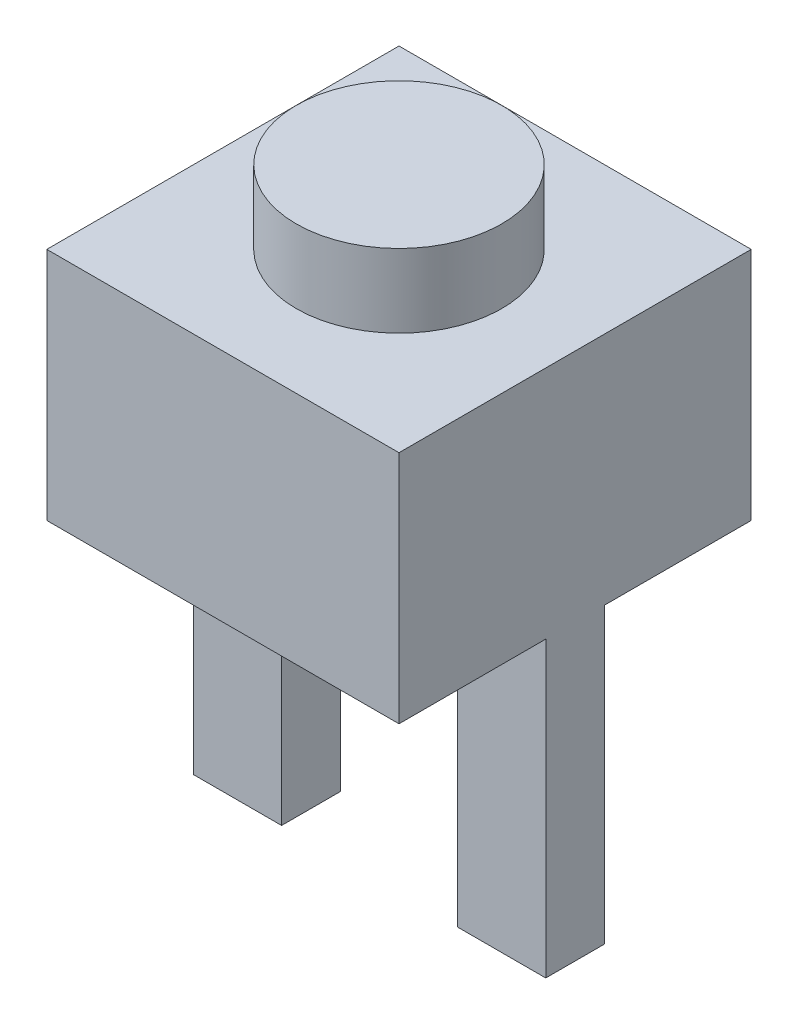
ISO-10303-21;
HEADER;
FILE_DESCRIPTION(('STEP AP214'),'2;1');
FILE_NAME('part.step','',(''),(''),'','','');
FILE_SCHEMA(('AUTOMOTIVE_DESIGN { 1 0 10303 214 1 1 1 1 }'));
ENDSEC;
DATA;
#1=APPLICATION_CONTEXT('core data for automotive mechanical design processes');
#2=APPLICATION_PROTOCOL_DEFINITION('international standard','automotive_design',2000,#1);
#3=PRODUCT_CONTEXT('',#1,'mechanical');
#4=PRODUCT('Part','Part','',(#3));
#5=PRODUCT_RELATED_PRODUCT_CATEGORY('part','',(#4));
#6=PRODUCT_DEFINITION_FORMATION('','',#4);
#7=PRODUCT_DEFINITION_CONTEXT('part definition',#1,'design');
#8=PRODUCT_DEFINITION('design','',#6,#7);
#9=PRODUCT_DEFINITION_SHAPE('','',#8);
#10=(LENGTH_UNIT() NAMED_UNIT(*) SI_UNIT(.MILLI.,.METRE.));
#11=(NAMED_UNIT(*) PLANE_ANGLE_UNIT() SI_UNIT($,.RADIAN.));
#12=(NAMED_UNIT(*) SI_UNIT($,.STERADIAN.) SOLID_ANGLE_UNIT());
#13=UNCERTAINTY_MEASURE_WITH_UNIT(LENGTH_MEASURE(1.E-05),#10,'distance_accuracy_value','');
#14=(GEOMETRIC_REPRESENTATION_CONTEXT(3) GLOBAL_UNCERTAINTY_ASSIGNED_CONTEXT((#13)) GLOBAL_UNIT_ASSIGNED_CONTEXT((#10,
#11,#12)) REPRESENTATION_CONTEXT('',''));
#15=CARTESIAN_POINT('',(0.,0.,0.));
#16=DIRECTION('',(0.,0.,1.));
#17=DIRECTION('',(1.,0.,0.));
#18=AXIS2_PLACEMENT_3D('',#15,#16,#17);
#19=CARTESIAN_POINT('',(0.,0.,0.));
#20=DIRECTION('',(0.,-1.,0.));
#21=DIRECTION('',(0.,0.,-1.));
#22=AXIS2_PLACEMENT_3D('',#19,#20,#21);
#23=PLANE('',#22);
#24=DIRECTION('',(0.,0.,-1.));
#25=VECTOR('',#24,1.);
#26=CARTESIAN_POINT('',(-1.5,0.,0.5));
#27=LINE('',#26,#25);
#28=CARTESIAN_POINT('',(-1.5,0.,0.5));
#29=VERTEX_POINT('',#28);
#30=CARTESIAN_POINT('',(-1.5,0.,-0.5));
#31=VERTEX_POINT('',#30);
#32=EDGE_CURVE('E57',#29,#31,#27,.T.);
#33=ORIENTED_EDGE('',*,*,#32,.T.);
#34=DIRECTION('',(1.,0.,0.));
#35=VECTOR('',#34,1.);
#36=CARTESIAN_POINT('',(-3.,0.,-0.5));
#37=LINE('',#36,#35);
#38=CARTESIAN_POINT('',(-3.,0.,-0.5));
#39=VERTEX_POINT('',#38);
#40=EDGE_CURVE('E155',#39,#31,#37,.T.);
#41=ORIENTED_EDGE('',*,*,#40,.F.);
#42=DIRECTION('',(0.,0.,-1.));
#43=VECTOR('',#42,1.);
#44=CARTESIAN_POINT('',(-3.,0.,3.));
#45=LINE('',#44,#43);
#46=CARTESIAN_POINT('',(-3.,0.,-3.));
#47=VERTEX_POINT('',#46);
#48=EDGE_CURVE('E136',#39,#47,#45,.T.);
#49=ORIENTED_EDGE('',*,*,#48,.T.);
#50=DIRECTION('',(1.,0.,0.));
#51=VECTOR('',#50,1.);
#52=CARTESIAN_POINT('',(-3.,0.,-3.));
#53=LINE('',#52,#51);
#54=CARTESIAN_POINT('',(3.,0.,-3.));
#55=VERTEX_POINT('',#54);
#56=EDGE_CURVE('E135',#47,#55,#53,.T.);
#57=ORIENTED_EDGE('',*,*,#56,.T.);
#58=DIRECTION('',(0.,0.,-1.));
#59=VECTOR('',#58,1.);
#60=CARTESIAN_POINT('',(3.,0.,3.));
#61=LINE('',#60,#59);
#62=CARTESIAN_POINT('',(3.,0.,-0.5));
#63=VERTEX_POINT('',#62);
#64=EDGE_CURVE('E234',#63,#55,#61,.T.);
#65=ORIENTED_EDGE('',*,*,#64,.F.);
#66=DIRECTION('',(-1.,0.,0.));
#67=VECTOR('',#66,1.);
#68=CARTESIAN_POINT('',(0.,0.,-0.5));
#69=LINE('',#68,#67);
#70=CARTESIAN_POINT('',(1.5,0.,-0.5));
#71=VERTEX_POINT('',#70);
#72=EDGE_CURVE('E178',#63,#71,#69,.T.);
#73=ORIENTED_EDGE('',*,*,#72,.T.);
#74=DIRECTION('',(0.,0.,-1.));
#75=VECTOR('',#74,1.);
#76=CARTESIAN_POINT('',(1.5,0.,0.));
#77=LINE('',#76,#75);
#78=CARTESIAN_POINT('',(1.5,0.,0.5));
#79=VERTEX_POINT('',#78);
#80=EDGE_CURVE('E192',#79,#71,#77,.T.);
#81=ORIENTED_EDGE('',*,*,#80,.F.);
#82=DIRECTION('',(-1.,0.,0.));
#83=VECTOR('',#82,1.);
#84=CARTESIAN_POINT('',(0.,0.,0.5));
#85=LINE('',#84,#83);
#86=CARTESIAN_POINT('',(3.,0.,0.5));
#87=VERTEX_POINT('',#86);
#88=EDGE_CURVE('E164',#87,#79,#85,.T.);
#89=ORIENTED_EDGE('',*,*,#88,.F.);
#90=CARTESIAN_POINT('',(3.,0.,3.));
#91=VERTEX_POINT('',#90);
#92=EDGE_CURVE('E235',#91,#87,#61,.T.);
#93=ORIENTED_EDGE('',*,*,#92,.F.);
#94=DIRECTION('',(1.,0.,0.));
#95=VECTOR('',#94,1.);
#96=CARTESIAN_POINT('',(-3.,0.,3.));
#97=LINE('',#96,#95);
#98=CARTESIAN_POINT('',(-3.,0.,3.));
#99=VERTEX_POINT('',#98);
#100=EDGE_CURVE('E132',#99,#91,#97,.T.);
#101=ORIENTED_EDGE('',*,*,#100,.F.);
#102=CARTESIAN_POINT('',(-3.,0.,0.5));
#103=VERTEX_POINT('',#102);
#104=EDGE_CURVE('E129',#99,#103,#45,.T.);
#105=ORIENTED_EDGE('',*,*,#104,.T.);
#106=DIRECTION('',(1.,0.,0.));
#107=VECTOR('',#106,1.);
#108=CARTESIAN_POINT('',(-3.,0.,0.5));
#109=LINE('',#108,#107);
#110=EDGE_CURVE('E62',#103,#29,#109,.T.);
#111=ORIENTED_EDGE('',*,*,#110,.T.);
#112=EDGE_LOOP('',(#33,#41,#49,#57,#65,#73,#81,#89,#93,#101,#105,#111));
#113=FACE_BOUND('',#112,.T.);
#114=ADVANCED_FACE('F39',(#113),#23,.T.);
#115=CARTESIAN_POINT('',(-3.,4.,3.));
#116=DIRECTION('',(-1.,0.,0.));
#117=DIRECTION('',(0.,0.,1.));
#118=AXIS2_PLACEMENT_3D('',#115,#116,#117);
#119=PLANE('',#118);
#120=ORIENTED_EDGE('',*,*,#104,.F.);
#121=DIRECTION('',(0.,-1.,0.));
#122=VECTOR('',#121,1.);
#123=CARTESIAN_POINT('',(-3.,4.,3.));
#124=LINE('',#123,#122);
#125=CARTESIAN_POINT('',(-3.,4.,3.));
#126=VERTEX_POINT('',#125);
#127=EDGE_CURVE('E49',#126,#99,#124,.T.);
#128=ORIENTED_EDGE('',*,*,#127,.F.);
#129=DIRECTION('',(0.,0.,-1.));
#130=VECTOR('',#129,1.);
#131=CARTESIAN_POINT('',(-3.,4.,3.));
#132=LINE('',#131,#130);
#133=CARTESIAN_POINT('',(-3.,4.,-3.));
#134=VERTEX_POINT('',#133);
#135=EDGE_CURVE('E217',#126,#134,#132,.T.);
#136=ORIENTED_EDGE('',*,*,#135,.T.);
#137=DIRECTION('',(0.,-1.,0.));
#138=VECTOR('',#137,1.);
#139=CARTESIAN_POINT('',(-3.,4.,-3.));
#140=LINE('',#139,#138);
#141=EDGE_CURVE('E43',#134,#47,#140,.T.);
#142=ORIENTED_EDGE('',*,*,#141,.T.);
#143=ORIENTED_EDGE('',*,*,#48,.F.);
#144=DIRECTION('',(0.,1.,0.));
#145=VECTOR('',#144,1.);
#146=CARTESIAN_POINT('',(-3.,-5.,-0.5));
#147=LINE('',#146,#145);
#148=CARTESIAN_POINT('',(-3.,-5.,-0.5));
#149=VERTEX_POINT('',#148);
#150=EDGE_CURVE('E432',#149,#39,#147,.T.);
#151=ORIENTED_EDGE('',*,*,#150,.F.);
#152=DIRECTION('',(0.,0.,-1.));
#153=VECTOR('',#152,1.);
#154=CARTESIAN_POINT('',(-3.,-5.,0.5));
#155=LINE('',#154,#153);
#156=CARTESIAN_POINT('',(-3.,-5.,0.5));
#157=VERTEX_POINT('',#156);
#158=EDGE_CURVE('E142',#157,#149,#155,.T.);
#159=ORIENTED_EDGE('',*,*,#158,.F.);
#160=DIRECTION('',(0.,1.,0.));
#161=VECTOR('',#160,1.);
#162=CARTESIAN_POINT('',(-3.,-5.,0.5));
#163=LINE('',#162,#161);
#164=EDGE_CURVE('E139',#157,#103,#163,.T.);
#165=ORIENTED_EDGE('',*,*,#164,.T.);
#166=EDGE_LOOP('',(#120,#128,#136,#142,#143,#151,#159,#165));
#167=FACE_BOUND('',#166,.T.);
#168=ADVANCED_FACE('F41',(#167),#119,.T.);
#169=CARTESIAN_POINT('',(-3.,4.,3.));
#170=DIRECTION('',(0.,0.,-1.));
#171=DIRECTION('',(-1.,0.,0.));
#172=AXIS2_PLACEMENT_3D('',#169,#170,#171);
#173=PLANE('',#172);
#174=ORIENTED_EDGE('',*,*,#100,.T.);
#175=DIRECTION('',(0.,-1.,0.));
#176=VECTOR('',#175,1.);
#177=CARTESIAN_POINT('',(3.,4.,3.));
#178=LINE('',#177,#176);
#179=CARTESIAN_POINT('',(3.,4.,3.));
#180=VERTEX_POINT('',#179);
#181=EDGE_CURVE('E243',#180,#91,#178,.T.);
#182=ORIENTED_EDGE('',*,*,#181,.F.);
#183=DIRECTION('',(1.,0.,0.));
#184=VECTOR('',#183,1.);
#185=CARTESIAN_POINT('',(-3.,4.,3.));
#186=LINE('',#185,#184);
#187=EDGE_CURVE('E228',#126,#180,#186,.T.);
#188=ORIENTED_EDGE('',*,*,#187,.F.);
#189=ORIENTED_EDGE('',*,*,#127,.T.);
#190=EDGE_LOOP('',(#174,#182,#188,#189));
#191=FACE_BOUND('',#190,.T.);
#192=ADVANCED_FACE('F280',(#191),#173,.F.);
#193=CARTESIAN_POINT('',(3.,4.,3.));
#194=DIRECTION('',(-1.,0.,0.));
#195=DIRECTION('',(0.,0.,1.));
#196=AXIS2_PLACEMENT_3D('',#193,#194,#195);
#197=PLANE('',#196);
#198=ORIENTED_EDGE('',*,*,#92,.T.);
#199=DIRECTION('',(0.,1.,0.));
#200=VECTOR('',#199,1.);
#201=CARTESIAN_POINT('',(3.,-5.,0.5));
#202=LINE('',#201,#200);
#203=CARTESIAN_POINT('',(3.,-5.,0.5));
#204=VERTEX_POINT('',#203);
#205=EDGE_CURVE('E188',#204,#87,#202,.T.);
#206=ORIENTED_EDGE('',*,*,#205,.F.);
#207=DIRECTION('',(0.,0.,1.));
#208=VECTOR('',#207,1.);
#209=CARTESIAN_POINT('',(3.,-5.,0.));
#210=LINE('',#209,#208);
#211=CARTESIAN_POINT('',(3.,-5.,-0.5));
#212=VERTEX_POINT('',#211);
#213=EDGE_CURVE('E185',#212,#204,#210,.T.);
#214=ORIENTED_EDGE('',*,*,#213,.F.);
#215=DIRECTION('',(0.,1.,0.));
#216=VECTOR('',#215,1.);
#217=CARTESIAN_POINT('',(3.,-5.,-0.5));
#218=LINE('',#217,#216);
#219=EDGE_CURVE('E201',#212,#63,#218,.T.);
#220=ORIENTED_EDGE('',*,*,#219,.T.);
#221=ORIENTED_EDGE('',*,*,#64,.T.);
#222=DIRECTION('',(0.,-1.,0.));
#223=VECTOR('',#222,1.);
#224=CARTESIAN_POINT('',(3.,4.,-3.));
#225=LINE('',#224,#223);
#226=CARTESIAN_POINT('',(3.,4.,-3.));
#227=VERTEX_POINT('',#226);
#228=EDGE_CURVE('E246',#227,#55,#225,.T.);
#229=ORIENTED_EDGE('',*,*,#228,.F.);
#230=DIRECTION('',(0.,0.,-1.));
#231=VECTOR('',#230,1.);
#232=CARTESIAN_POINT('',(3.,4.,3.));
#233=LINE('',#232,#231);
#234=EDGE_CURVE('E225',#180,#227,#233,.T.);
#235=ORIENTED_EDGE('',*,*,#234,.F.);
#236=ORIENTED_EDGE('',*,*,#181,.T.);
#237=EDGE_LOOP('',(#198,#206,#214,#220,#221,#229,#235,#236));
#238=FACE_BOUND('',#237,.T.);
#239=ADVANCED_FACE('F262',(#238),#197,.F.);
#240=CARTESIAN_POINT('',(-3.,4.,-3.));
#241=DIRECTION('',(0.,0.,-1.));
#242=DIRECTION('',(-1.,0.,0.));
#243=AXIS2_PLACEMENT_3D('',#240,#241,#242);
#244=PLANE('',#243);
#245=ORIENTED_EDGE('',*,*,#56,.F.);
#246=ORIENTED_EDGE('',*,*,#141,.F.);
#247=DIRECTION('',(1.,0.,0.));
#248=VECTOR('',#247,1.);
#249=CARTESIAN_POINT('',(-3.,4.,-3.));
#250=LINE('',#249,#248);
#251=EDGE_CURVE('E221',#134,#227,#250,.T.);
#252=ORIENTED_EDGE('',*,*,#251,.T.);
#253=ORIENTED_EDGE('',*,*,#228,.T.);
#254=EDGE_LOOP('',(#245,#246,#252,#253));
#255=FACE_BOUND('',#254,.T.);
#256=ADVANCED_FACE('F258',(#255),#244,.T.);
#257=CARTESIAN_POINT('',(0.,4.,0.));
#258=DIRECTION('',(0.,-1.,0.));
#259=DIRECTION('',(0.,0.,-1.));
#260=AXIS2_PLACEMENT_3D('',#257,#258,#259);
#261=PLANE('',#260);
#262=CARTESIAN_POINT('',(0.,4.,0.));
#263=DIRECTION('',(0.,1.,0.));
#264=DIRECTION('',(0.,0.,1.));
#265=AXIS2_PLACEMENT_3D('',#262,#263,#264);
#266=CIRCLE('',#265,1.75);
#267=CARTESIAN_POINT('',(0.,4.,1.75));
#268=VERTEX_POINT('',#267);
#269=EDGE_CURVE('E11',#268,#268,#266,.T.);
#270=ORIENTED_EDGE('',*,*,#269,.F.);
#271=EDGE_LOOP('',(#270));
#272=FACE_BOUND('',#271,.T.);
#273=ORIENTED_EDGE('',*,*,#135,.F.);
#274=ORIENTED_EDGE('',*,*,#187,.T.);
#275=ORIENTED_EDGE('',*,*,#234,.T.);
#276=ORIENTED_EDGE('',*,*,#251,.F.);
#277=EDGE_LOOP('',(#273,#274,#275,#276));
#278=FACE_BOUND('',#277,.T.);
#279=ADVANCED_FACE('F282',(#272,#278),#261,.F.);
#280=CARTESIAN_POINT('',(0.,5.25,0.));
#281=DIRECTION('',(0.,-1.,0.));
#282=DIRECTION('',(0.,0.,-1.));
#283=AXIS2_PLACEMENT_3D('',#280,#281,#282);
#284=CYLINDRICAL_SURFACE('',#283,1.75);
#285=CARTESIAN_POINT('',(0.,5.25,0.));
#286=DIRECTION('',(0.,1.,0.));
#287=DIRECTION('',(0.,0.,1.));
#288=AXIS2_PLACEMENT_3D('',#285,#286,#287);
#289=CIRCLE('',#288,1.75);
#290=CARTESIAN_POINT('',(0.,5.25,1.75));
#291=VERTEX_POINT('',#290);
#292=EDGE_CURVE('E213',#291,#291,#289,.T.);
#293=ORIENTED_EDGE('',*,*,#292,.F.);
#294=EDGE_LOOP('',(#293));
#295=FACE_BOUND('',#294,.T.);
#296=ORIENTED_EDGE('',*,*,#269,.T.);
#297=EDGE_LOOP('',(#296));
#298=FACE_BOUND('',#297,.T.);
#299=ADVANCED_FACE('F284',(#295,#298),#284,.T.);
#300=CARTESIAN_POINT('',(0.,5.25,0.));
#301=DIRECTION('',(0.,1.,0.));
#302=DIRECTION('',(0.,0.,1.));
#303=AXIS2_PLACEMENT_3D('',#300,#301,#302);
#304=PLANE('',#303);
#305=ORIENTED_EDGE('',*,*,#292,.T.);
#306=EDGE_LOOP('',(#305));
#307=FACE_BOUND('',#306,.T.);
#308=ADVANCED_FACE('F291',(#307),#304,.T.);
#309=CARTESIAN_POINT('',(0.,-5.,0.5));
#310=DIRECTION('',(0.,0.,-1.));
#311=DIRECTION('',(-1.,0.,0.));
#312=AXIS2_PLACEMENT_3D('',#309,#310,#311);
#313=PLANE('',#312);
#314=ORIENTED_EDGE('',*,*,#88,.T.);
#315=DIRECTION('',(0.,1.,0.));
#316=VECTOR('',#315,1.);
#317=CARTESIAN_POINT('',(1.5,-5.,0.5));
#318=LINE('',#317,#316);
#319=CARTESIAN_POINT('',(1.5,-5.,0.5));
#320=VERTEX_POINT('',#319);
#321=EDGE_CURVE('E209',#320,#79,#318,.T.);
#322=ORIENTED_EDGE('',*,*,#321,.F.);
#323=DIRECTION('',(-1.,0.,0.));
#324=VECTOR('',#323,1.);
#325=CARTESIAN_POINT('',(0.,-5.,0.5));
#326=LINE('',#325,#324);
#327=EDGE_CURVE('E173',#204,#320,#326,.T.);
#328=ORIENTED_EDGE('',*,*,#327,.F.);
#329=ORIENTED_EDGE('',*,*,#205,.T.);
#330=EDGE_LOOP('',(#314,#322,#328,#329));
#331=FACE_BOUND('',#330,.T.);
#332=ADVANCED_FACE('F276',(#331),#313,.F.);
#333=CARTESIAN_POINT('',(1.5,-5.,0.));
#334=DIRECTION('',(1.,0.,0.));
#335=DIRECTION('',(0.,0.,-1.));
#336=AXIS2_PLACEMENT_3D('',#333,#334,#335);
#337=PLANE('',#336);
#338=ORIENTED_EDGE('',*,*,#80,.T.);
#339=DIRECTION('',(0.,1.,0.));
#340=VECTOR('',#339,1.);
#341=CARTESIAN_POINT('',(1.5,-5.,-0.5));
#342=LINE('',#341,#340);
#343=CARTESIAN_POINT('',(1.5,-5.,-0.5));
#344=VERTEX_POINT('',#343);
#345=EDGE_CURVE('E205',#344,#71,#342,.T.);
#346=ORIENTED_EDGE('',*,*,#345,.F.);
#347=DIRECTION('',(0.,0.,-1.));
#348=VECTOR('',#347,1.);
#349=CARTESIAN_POINT('',(1.5,-5.,0.));
#350=LINE('',#349,#348);
#351=EDGE_CURVE('E177',#320,#344,#350,.T.);
#352=ORIENTED_EDGE('',*,*,#351,.F.);
#353=ORIENTED_EDGE('',*,*,#321,.T.);
#354=EDGE_LOOP('',(#338,#346,#352,#353));
#355=FACE_BOUND('',#354,.T.);
#356=ADVANCED_FACE('F273',(#355),#337,.F.);
#357=CARTESIAN_POINT('',(0.,-5.,-0.5));
#358=DIRECTION('',(0.,0.,-1.));
#359=DIRECTION('',(-1.,0.,0.));
#360=AXIS2_PLACEMENT_3D('',#357,#358,#359);
#361=PLANE('',#360);
#362=ORIENTED_EDGE('',*,*,#72,.F.);
#363=ORIENTED_EDGE('',*,*,#219,.F.);
#364=DIRECTION('',(-1.,0.,0.));
#365=VECTOR('',#364,1.);
#366=CARTESIAN_POINT('',(0.,-5.,-0.5));
#367=LINE('',#366,#365);
#368=EDGE_CURVE('E181',#212,#344,#367,.T.);
#369=ORIENTED_EDGE('',*,*,#368,.T.);
#370=ORIENTED_EDGE('',*,*,#345,.T.);
#371=EDGE_LOOP('',(#362,#363,#369,#370));
#372=FACE_BOUND('',#371,.T.);
#373=ADVANCED_FACE('F269',(#372),#361,.T.);
#374=CARTESIAN_POINT('',(0.,-5.,0.));
#375=DIRECTION('',(0.,-1.,0.));
#376=DIRECTION('',(0.,0.,-1.));
#377=AXIS2_PLACEMENT_3D('',#374,#375,#376);
#378=PLANE('',#377);
#379=ORIENTED_EDGE('',*,*,#327,.T.);
#380=ORIENTED_EDGE('',*,*,#351,.T.);
#381=ORIENTED_EDGE('',*,*,#368,.F.);
#382=ORIENTED_EDGE('',*,*,#213,.T.);
#383=EDGE_LOOP('',(#379,#380,#381,#382));
#384=FACE_BOUND('',#383,.T.);
#385=ADVANCED_FACE('F378',(#384),#378,.T.);
#386=CARTESIAN_POINT('',(-3.,-5.,-0.5));
#387=DIRECTION('',(0.,0.,1.));
#388=DIRECTION('',(1.,0.,0.));
#389=AXIS2_PLACEMENT_3D('',#386,#387,#388);
#390=PLANE('',#389);
#391=ORIENTED_EDGE('',*,*,#40,.T.);
#392=DIRECTION('',(0.,1.,0.));
#393=VECTOR('',#392,1.);
#394=CARTESIAN_POINT('',(-1.5,-5.,-0.5));
#395=LINE('',#394,#393);
#396=CARTESIAN_POINT('',(-1.5,-5.,-0.5));
#397=VERTEX_POINT('',#396);
#398=EDGE_CURVE('E434',#397,#31,#395,.T.);
#399=ORIENTED_EDGE('',*,*,#398,.F.);
#400=DIRECTION('',(1.,0.,0.));
#401=VECTOR('',#400,1.);
#402=CARTESIAN_POINT('',(-3.,-5.,-0.5));
#403=LINE('',#402,#401);
#404=EDGE_CURVE('E157',#149,#397,#403,.T.);
#405=ORIENTED_EDGE('',*,*,#404,.F.);
#406=ORIENTED_EDGE('',*,*,#150,.T.);
#407=EDGE_LOOP('',(#391,#399,#405,#406));
#408=FACE_BOUND('',#407,.T.);
#409=ADVANCED_FACE('F386',(#408),#390,.F.);
#410=CARTESIAN_POINT('',(-1.5,-5.,0.5));
#411=DIRECTION('',(1.,0.,0.));
#412=DIRECTION('',(0.,0.,-1.));
#413=AXIS2_PLACEMENT_3D('',#410,#411,#412);
#414=PLANE('',#413);
#415=ORIENTED_EDGE('',*,*,#32,.F.);
#416=DIRECTION('',(0.,1.,0.));
#417=VECTOR('',#416,1.);
#418=CARTESIAN_POINT('',(-1.5,-5.,0.5));
#419=LINE('',#418,#417);
#420=CARTESIAN_POINT('',(-1.5,-5.,0.5));
#421=VERTEX_POINT('',#420);
#422=EDGE_CURVE('E148',#421,#29,#419,.T.);
#423=ORIENTED_EDGE('',*,*,#422,.F.);
#424=DIRECTION('',(0.,0.,-1.));
#425=VECTOR('',#424,1.);
#426=CARTESIAN_POINT('',(-1.5,-5.,0.5));
#427=LINE('',#426,#425);
#428=EDGE_CURVE('E167',#421,#397,#427,.T.);
#429=ORIENTED_EDGE('',*,*,#428,.T.);
#430=ORIENTED_EDGE('',*,*,#398,.T.);
#431=EDGE_LOOP('',(#415,#423,#429,#430));
#432=FACE_BOUND('',#431,.T.);
#433=ADVANCED_FACE('F395',(#432),#414,.T.);
#434=CARTESIAN_POINT('',(-3.,-5.,0.5));
#435=DIRECTION('',(0.,0.,1.));
#436=DIRECTION('',(1.,0.,0.));
#437=AXIS2_PLACEMENT_3D('',#434,#435,#436);
#438=PLANE('',#437);
#439=ORIENTED_EDGE('',*,*,#110,.F.);
#440=ORIENTED_EDGE('',*,*,#164,.F.);
#441=DIRECTION('',(1.,0.,0.));
#442=VECTOR('',#441,1.);
#443=CARTESIAN_POINT('',(-3.,-5.,0.5));
#444=LINE('',#443,#442);
#445=EDGE_CURVE('E147',#157,#421,#444,.T.);
#446=ORIENTED_EDGE('',*,*,#445,.T.);
#447=ORIENTED_EDGE('',*,*,#422,.T.);
#448=EDGE_LOOP('',(#439,#440,#446,#447));
#449=FACE_BOUND('',#448,.T.);
#450=ADVANCED_FACE('F150',(#449),#438,.T.);
#451=CARTESIAN_POINT('',(0.,-5.,0.));
#452=DIRECTION('',(0.,-1.,0.));
#453=DIRECTION('',(0.,0.,-1.));
#454=AXIS2_PLACEMENT_3D('',#451,#452,#453);
#455=PLANE('',#454);
#456=ORIENTED_EDGE('',*,*,#158,.T.);
#457=ORIENTED_EDGE('',*,*,#404,.T.);
#458=ORIENTED_EDGE('',*,*,#428,.F.);
#459=ORIENTED_EDGE('',*,*,#445,.F.);
#460=EDGE_LOOP('',(#456,#457,#458,#459));
#461=FACE_BOUND('',#460,.T.);
#462=ADVANCED_FACE('F412',(#461),#455,.T.);
#463=CLOSED_SHELL('',(#114,#168,#192,#239,#256,#279,#299,#308,#332,#356,#373,#385,#409,#433,
#450,#462));
#464=MANIFOLD_SOLID_BREP('B2',#463);
#465=ADVANCED_BREP_SHAPE_REPRESENTATION('',(#18,#464),#14);
#466=SHAPE_DEFINITION_REPRESENTATION(#9,#465);
ENDSEC;
END-ISO-10303-21;
